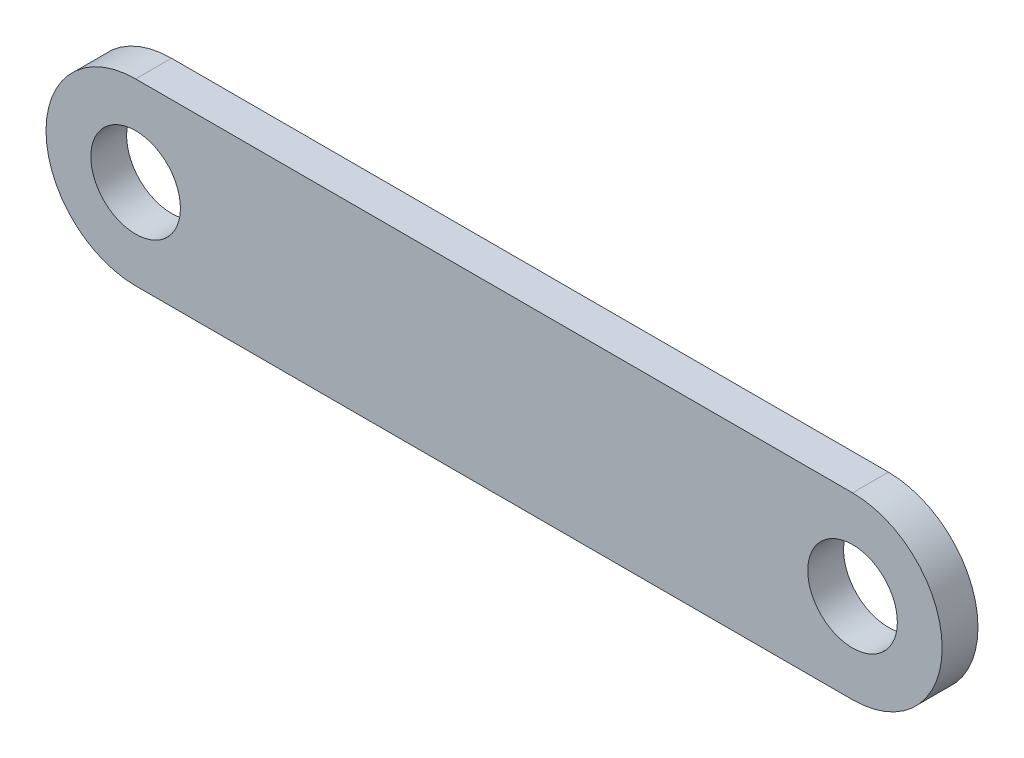
ISO-10303-21;
HEADER;
FILE_DESCRIPTION(('STEP AP214'),'2;1');
FILE_NAME('part.step','',(''),(''),'','','');
FILE_SCHEMA(('AUTOMOTIVE_DESIGN { 1 0 10303 214 1 1 1 1 }'));
ENDSEC;
DATA;
#1=APPLICATION_CONTEXT('core data for automotive mechanical design processes');
#2=APPLICATION_PROTOCOL_DEFINITION('international standard','automotive_design',2000,#1);
#3=PRODUCT_CONTEXT('',#1,'mechanical');
#4=PRODUCT('Part','Part','',(#3));
#5=PRODUCT_RELATED_PRODUCT_CATEGORY('part','',(#4));
#6=PRODUCT_DEFINITION_FORMATION('','',#4);
#7=PRODUCT_DEFINITION_CONTEXT('part definition',#1,'design');
#8=PRODUCT_DEFINITION('design','',#6,#7);
#9=PRODUCT_DEFINITION_SHAPE('','',#8);
#10=(LENGTH_UNIT() NAMED_UNIT(*) SI_UNIT(.MILLI.,.METRE.));
#11=(NAMED_UNIT(*) PLANE_ANGLE_UNIT() SI_UNIT($,.RADIAN.));
#12=(NAMED_UNIT(*) SI_UNIT($,.STERADIAN.) SOLID_ANGLE_UNIT());
#13=UNCERTAINTY_MEASURE_WITH_UNIT(LENGTH_MEASURE(1.E-05),#10,'distance_accuracy_value','');
#14=(GEOMETRIC_REPRESENTATION_CONTEXT(3) GLOBAL_UNCERTAINTY_ASSIGNED_CONTEXT((#13)) GLOBAL_UNIT_ASSIGNED_CONTEXT((#10,
#11,#12)) REPRESENTATION_CONTEXT('',''));
#15=CARTESIAN_POINT('',(0.,0.,0.));
#16=DIRECTION('',(0.,0.,1.));
#17=DIRECTION('',(1.,0.,0.));
#18=AXIS2_PLACEMENT_3D('',#15,#16,#17);
#19=CARTESIAN_POINT('',(-20.,0.,2.));
#20=DIRECTION('',(0.,0.,1.));
#21=DIRECTION('',(1.,0.,0.));
#22=AXIS2_PLACEMENT_3D('',#19,#20,#21);
#23=PLANE('',#22);
#24=CARTESIAN_POINT('',(-20.,0.,2.));
#25=DIRECTION('',(0.,0.,1.));
#26=DIRECTION('',(1.,0.,0.));
#27=AXIS2_PLACEMENT_3D('',#24,#25,#26);
#28=CIRCLE('',#27,2.5);
#29=CARTESIAN_POINT('',(-17.5,0.,2.));
#30=VERTEX_POINT('',#29);
#31=EDGE_CURVE('E99',#30,#30,#28,.T.);
#32=ORIENTED_EDGE('',*,*,#31,.F.);
#33=EDGE_LOOP('',(#32));
#34=FACE_BOUND('',#33,.T.);
#35=CARTESIAN_POINT('',(-20.,0.,2.));
#36=DIRECTION('',(0.,0.,1.));
#37=DIRECTION('',(1.,0.,0.));
#38=AXIS2_PLACEMENT_3D('',#35,#36,#37);
#39=CIRCLE('',#38,5.);
#40=CARTESIAN_POINT('',(-20.,5.,2.));
#41=VERTEX_POINT('',#40);
#42=CARTESIAN_POINT('',(-20.,-5.,2.));
#43=VERTEX_POINT('',#42);
#44=EDGE_CURVE('E84',#41,#43,#39,.T.);
#45=ORIENTED_EDGE('',*,*,#44,.T.);
#46=DIRECTION('',(1.,0.,0.));
#47=VECTOR('',#46,1.);
#48=CARTESIAN_POINT('',(-20.,-5.,2.));
#49=LINE('',#48,#47);
#50=CARTESIAN_POINT('',(20.,-5.,2.));
#51=VERTEX_POINT('',#50);
#52=EDGE_CURVE('E79',#43,#51,#49,.T.);
#53=ORIENTED_EDGE('',*,*,#52,.T.);
#54=CARTESIAN_POINT('',(20.,0.,2.));
#55=DIRECTION('',(0.,0.,1.));
#56=DIRECTION('',(1.,0.,0.));
#57=AXIS2_PLACEMENT_3D('',#54,#55,#56);
#58=CIRCLE('',#57,5.);
#59=CARTESIAN_POINT('',(20.,5.,2.));
#60=VERTEX_POINT('',#59);
#61=EDGE_CURVE('E82',#51,#60,#58,.T.);
#62=ORIENTED_EDGE('',*,*,#61,.T.);
#63=DIRECTION('',(-1.,0.,0.));
#64=VECTOR('',#63,1.);
#65=CARTESIAN_POINT('',(-20.,5.,2.));
#66=LINE('',#65,#64);
#67=EDGE_CURVE('E49',#60,#41,#66,.T.);
#68=ORIENTED_EDGE('',*,*,#67,.T.);
#69=EDGE_LOOP('',(#45,#53,#62,#68));
#70=FACE_BOUND('',#69,.T.);
#71=CARTESIAN_POINT('',(20.,0.,2.));
#72=DIRECTION('',(0.,0.,1.));
#73=DIRECTION('',(1.,0.,0.));
#74=AXIS2_PLACEMENT_3D('',#71,#72,#73);
#75=CIRCLE('',#74,2.5);
#76=CARTESIAN_POINT('',(22.5,0.,2.));
#77=VERTEX_POINT('',#76);
#78=EDGE_CURVE('E114',#77,#77,#75,.T.);
#79=ORIENTED_EDGE('',*,*,#78,.F.);
#80=EDGE_LOOP('',(#79));
#81=FACE_BOUND('',#80,.T.);
#82=ADVANCED_FACE('F32',(#34,#70,#81),#23,.T.);
#83=CARTESIAN_POINT('',(-20.,0.,0.));
#84=DIRECTION('',(0.,0.,1.));
#85=DIRECTION('',(1.,0.,0.));
#86=AXIS2_PLACEMENT_3D('',#83,#84,#85);
#87=PLANE('',#86);
#88=CARTESIAN_POINT('',(-20.,0.,0.));
#89=DIRECTION('',(0.,0.,1.));
#90=DIRECTION('',(1.,0.,0.));
#91=AXIS2_PLACEMENT_3D('',#88,#89,#90);
#92=CIRCLE('',#91,2.5);
#93=CARTESIAN_POINT('',(-17.5,0.,0.));
#94=VERTEX_POINT('',#93);
#95=EDGE_CURVE('E111',#94,#94,#92,.T.);
#96=ORIENTED_EDGE('',*,*,#95,.T.);
#97=EDGE_LOOP('',(#96));
#98=FACE_BOUND('',#97,.T.);
#99=CARTESIAN_POINT('',(-20.,0.,0.));
#100=DIRECTION('',(0.,0.,1.));
#101=DIRECTION('',(1.,0.,0.));
#102=AXIS2_PLACEMENT_3D('',#99,#100,#101);
#103=CIRCLE('',#102,5.);
#104=CARTESIAN_POINT('',(-20.,5.,0.));
#105=VERTEX_POINT('',#104);
#106=CARTESIAN_POINT('',(-20.,-5.,0.));
#107=VERTEX_POINT('',#106);
#108=EDGE_CURVE('E96',#105,#107,#103,.T.);
#109=ORIENTED_EDGE('',*,*,#108,.F.);
#110=DIRECTION('',(-1.,0.,0.));
#111=VECTOR('',#110,1.);
#112=CARTESIAN_POINT('',(-20.,5.,0.));
#113=LINE('',#112,#111);
#114=CARTESIAN_POINT('',(20.,5.,0.));
#115=VERTEX_POINT('',#114);
#116=EDGE_CURVE('E72',#115,#105,#113,.T.);
#117=ORIENTED_EDGE('',*,*,#116,.F.);
#118=CARTESIAN_POINT('',(20.,0.,0.));
#119=DIRECTION('',(0.,0.,1.));
#120=DIRECTION('',(1.,0.,0.));
#121=AXIS2_PLACEMENT_3D('',#118,#119,#120);
#122=CIRCLE('',#121,5.);
#123=CARTESIAN_POINT('',(20.,-5.,0.));
#124=VERTEX_POINT('',#123);
#125=EDGE_CURVE('E66',#124,#115,#122,.T.);
#126=ORIENTED_EDGE('',*,*,#125,.F.);
#127=DIRECTION('',(1.,0.,0.));
#128=VECTOR('',#127,1.);
#129=CARTESIAN_POINT('',(-20.,-5.,0.));
#130=LINE('',#129,#128);
#131=EDGE_CURVE('E88',#107,#124,#130,.T.);
#132=ORIENTED_EDGE('',*,*,#131,.F.);
#133=EDGE_LOOP('',(#109,#117,#126,#132));
#134=FACE_BOUND('',#133,.T.);
#135=CARTESIAN_POINT('',(20.,0.,0.));
#136=DIRECTION('',(0.,0.,1.));
#137=DIRECTION('',(1.,0.,0.));
#138=AXIS2_PLACEMENT_3D('',#135,#136,#137);
#139=CIRCLE('',#138,2.5);
#140=CARTESIAN_POINT('',(22.5,0.,0.));
#141=VERTEX_POINT('',#140);
#142=EDGE_CURVE('E117',#141,#141,#139,.T.);
#143=ORIENTED_EDGE('',*,*,#142,.T.);
#144=EDGE_LOOP('',(#143));
#145=FACE_BOUND('',#144,.T.);
#146=ADVANCED_FACE('F107',(#98,#134,#145),#87,.F.);
#147=CARTESIAN_POINT('',(-20.,0.,2.));
#148=DIRECTION('',(0.,0.,-1.));
#149=DIRECTION('',(-1.,0.,0.));
#150=AXIS2_PLACEMENT_3D('',#147,#148,#149);
#151=CYLINDRICAL_SURFACE('',#150,5.);
#152=ORIENTED_EDGE('',*,*,#108,.T.);
#153=DIRECTION('',(0.,0.,-1.));
#154=VECTOR('',#153,1.);
#155=CARTESIAN_POINT('',(-20.,-5.,2.));
#156=LINE('',#155,#154);
#157=EDGE_CURVE('E11',#43,#107,#156,.T.);
#158=ORIENTED_EDGE('',*,*,#157,.F.);
#159=ORIENTED_EDGE('',*,*,#44,.F.);
#160=DIRECTION('',(0.,0.,-1.));
#161=VECTOR('',#160,1.);
#162=CARTESIAN_POINT('',(-20.,5.,2.));
#163=LINE('',#162,#161);
#164=EDGE_CURVE('E92',#41,#105,#163,.T.);
#165=ORIENTED_EDGE('',*,*,#164,.T.);
#166=EDGE_LOOP('',(#152,#158,#159,#165));
#167=FACE_BOUND('',#166,.T.);
#168=ADVANCED_FACE('F34',(#167),#151,.T.);
#169=CARTESIAN_POINT('',(-20.,-5.,2.));
#170=DIRECTION('',(0.,1.,0.));
#171=DIRECTION('',(0.,0.,1.));
#172=AXIS2_PLACEMENT_3D('',#169,#170,#171);
#173=PLANE('',#172);
#174=ORIENTED_EDGE('',*,*,#131,.T.);
#175=DIRECTION('',(0.,0.,-1.));
#176=VECTOR('',#175,1.);
#177=CARTESIAN_POINT('',(20.,-5.,2.));
#178=LINE('',#177,#176);
#179=EDGE_CURVE('E41',#51,#124,#178,.T.);
#180=ORIENTED_EDGE('',*,*,#179,.F.);
#181=ORIENTED_EDGE('',*,*,#52,.F.);
#182=ORIENTED_EDGE('',*,*,#157,.T.);
#183=EDGE_LOOP('',(#174,#180,#181,#182));
#184=FACE_BOUND('',#183,.T.);
#185=ADVANCED_FACE('F87',(#184),#173,.F.);
#186=CARTESIAN_POINT('',(20.,0.,2.));
#187=DIRECTION('',(0.,0.,-1.));
#188=DIRECTION('',(-1.,0.,0.));
#189=AXIS2_PLACEMENT_3D('',#186,#187,#188);
#190=CYLINDRICAL_SURFACE('',#189,5.);
#191=ORIENTED_EDGE('',*,*,#125,.T.);
#192=DIRECTION('',(0.,0.,-1.));
#193=VECTOR('',#192,1.);
#194=CARTESIAN_POINT('',(20.,5.,2.));
#195=LINE('',#194,#193);
#196=EDGE_CURVE('E89',#60,#115,#195,.T.);
#197=ORIENTED_EDGE('',*,*,#196,.F.);
#198=ORIENTED_EDGE('',*,*,#61,.F.);
#199=ORIENTED_EDGE('',*,*,#179,.T.);
#200=EDGE_LOOP('',(#191,#197,#198,#199));
#201=FACE_BOUND('',#200,.T.);
#202=ADVANCED_FACE('F90',(#201),#190,.T.);
#203=CARTESIAN_POINT('',(-20.,5.,2.));
#204=DIRECTION('',(0.,-1.,0.));
#205=DIRECTION('',(0.,0.,-1.));
#206=AXIS2_PLACEMENT_3D('',#203,#204,#205);
#207=PLANE('',#206);
#208=ORIENTED_EDGE('',*,*,#116,.T.);
#209=ORIENTED_EDGE('',*,*,#164,.F.);
#210=ORIENTED_EDGE('',*,*,#67,.F.);
#211=ORIENTED_EDGE('',*,*,#196,.T.);
#212=EDGE_LOOP('',(#208,#209,#210,#211));
#213=FACE_BOUND('',#212,.T.);
#214=ADVANCED_FACE('F104',(#213),#207,.F.);
#215=CARTESIAN_POINT('',(-20.,0.,2.));
#216=DIRECTION('',(0.,0.,-1.));
#217=DIRECTION('',(-1.,0.,0.));
#218=AXIS2_PLACEMENT_3D('',#215,#216,#217);
#219=CYLINDRICAL_SURFACE('',#218,2.5);
#220=ORIENTED_EDGE('',*,*,#31,.T.);
#221=EDGE_LOOP('',(#220));
#222=FACE_BOUND('',#221,.T.);
#223=ORIENTED_EDGE('',*,*,#95,.F.);
#224=EDGE_LOOP('',(#223));
#225=FACE_BOUND('',#224,.T.);
#226=ADVANCED_FACE('F135',(#222,#225),#219,.F.);
#227=CARTESIAN_POINT('',(20.,0.,2.));
#228=DIRECTION('',(0.,0.,-1.));
#229=DIRECTION('',(-1.,0.,0.));
#230=AXIS2_PLACEMENT_3D('',#227,#228,#229);
#231=CYLINDRICAL_SURFACE('',#230,2.5);
#232=ORIENTED_EDGE('',*,*,#78,.T.);
#233=EDGE_LOOP('',(#232));
#234=FACE_BOUND('',#233,.T.);
#235=ORIENTED_EDGE('',*,*,#142,.F.);
#236=EDGE_LOOP('',(#235));
#237=FACE_BOUND('',#236,.T.);
#238=ADVANCED_FACE('F123',(#234,#237),#231,.F.);
#239=CLOSED_SHELL('',(#82,#146,#168,#185,#202,#214,#226,#238));
#240=MANIFOLD_SOLID_BREP('B2',#239);
#241=ADVANCED_BREP_SHAPE_REPRESENTATION('',(#18,#240),#14);
#242=SHAPE_DEFINITION_REPRESENTATION(#9,#241);
ENDSEC;
END-ISO-10303-21;
